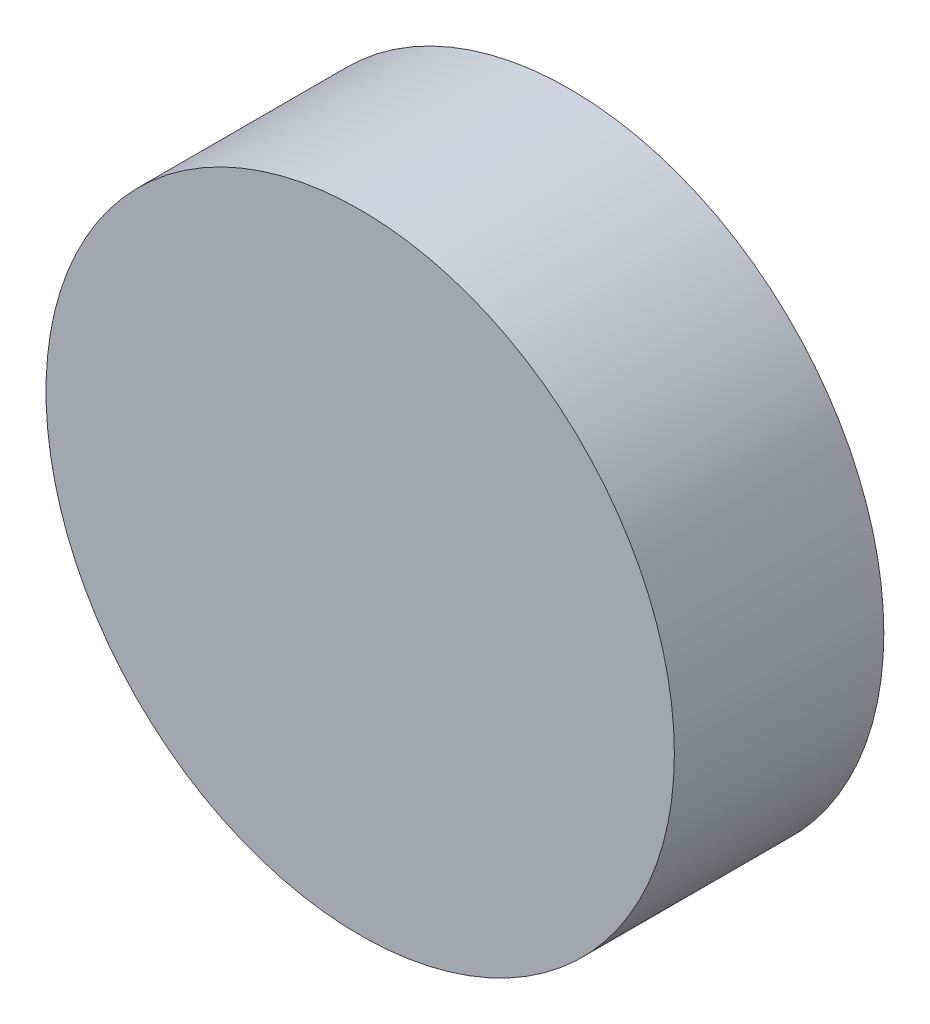
ISO-10303-21;
HEADER;
FILE_DESCRIPTION(('STEP AP214'),'2;1');
FILE_NAME('part.step','',(''),(''),'','','');
FILE_SCHEMA(('AUTOMOTIVE_DESIGN { 1 0 10303 214 1 1 1 1 }'));
ENDSEC;
DATA;
#1=APPLICATION_CONTEXT('core data for automotive mechanical design processes');
#2=APPLICATION_PROTOCOL_DEFINITION('international standard','automotive_design',2000,#1);
#3=PRODUCT_CONTEXT('',#1,'mechanical');
#4=PRODUCT('Part','Part','',(#3));
#5=PRODUCT_RELATED_PRODUCT_CATEGORY('part','',(#4));
#6=PRODUCT_DEFINITION_FORMATION('','',#4);
#7=PRODUCT_DEFINITION_CONTEXT('part definition',#1,'design');
#8=PRODUCT_DEFINITION('design','',#6,#7);
#9=PRODUCT_DEFINITION_SHAPE('','',#8);
#10=(LENGTH_UNIT() NAMED_UNIT(*) SI_UNIT(.MILLI.,.METRE.));
#11=(NAMED_UNIT(*) PLANE_ANGLE_UNIT() SI_UNIT($,.RADIAN.));
#12=(NAMED_UNIT(*) SI_UNIT($,.STERADIAN.) SOLID_ANGLE_UNIT());
#13=UNCERTAINTY_MEASURE_WITH_UNIT(LENGTH_MEASURE(1.E-05),#10,'distance_accuracy_value','');
#14=(GEOMETRIC_REPRESENTATION_CONTEXT(3) GLOBAL_UNCERTAINTY_ASSIGNED_CONTEXT((#13)) GLOBAL_UNIT_ASSIGNED_CONTEXT((#10,
#11,#12)) REPRESENTATION_CONTEXT('',''));
#15=CARTESIAN_POINT('',(0.,0.,0.));
#16=DIRECTION('',(0.,0.,1.));
#17=DIRECTION('',(1.,0.,0.));
#18=AXIS2_PLACEMENT_3D('',#15,#16,#17);
#19=CARTESIAN_POINT('',(16.252683353424,-4.898529243469,0.300000015786));
#20=DIRECTION('',(0.,0.,-1.));
#21=DIRECTION('',(1.,0.,0.));
#22=AXIS2_PLACEMENT_3D('',#19,#20,#21);
#23=CYLINDRICAL_SURFACE('',#22,0.15);
#24=CARTESIAN_POINT('',(16.252683353424,-4.898529243469,0.300000015786));
#25=DIRECTION('',(0.,0.,1.));
#26=DIRECTION('',(1.,0.,0.));
#27=AXIS2_PLACEMENT_3D('',#24,#25,#26);
#28=CIRCLE('',#27,0.15);
#29=CARTESIAN_POINT('',(16.402683353424,-4.898529243469,0.300000015786));
#30=VERTEX_POINT('',#29);
#31=EDGE_CURVE('E11',#30,#30,#28,.T.);
#32=ORIENTED_EDGE('',*,*,#31,.T.);
#33=DIRECTION('',(0.,0.,1.));
#34=VECTOR('',#33,1.);
#35=CARTESIAN_POINT('',(16.402683353424,-4.898529243469,0.300000015786));
#36=LINE('',#35,#34);
#37=CARTESIAN_POINT('',(16.402683353424,-4.898529243469,0.400000015786));
#38=VERTEX_POINT('',#37);
#39=EDGE_CURVE('E26',#30,#38,#36,.T.);
#40=ORIENTED_EDGE('',*,*,#39,.T.);
#41=CARTESIAN_POINT('',(16.252683353424,-4.898529243469,0.400000015786));
#42=DIRECTION('',(0.,0.,1.));
#43=DIRECTION('',(1.,0.,0.));
#44=AXIS2_PLACEMENT_3D('',#41,#42,#43);
#45=CIRCLE('',#44,0.15);
#46=EDGE_CURVE('E20',#38,#38,#45,.T.);
#47=ORIENTED_EDGE('',*,*,#46,.F.);
#48=ORIENTED_EDGE('',*,*,#39,.F.);
#49=EDGE_LOOP('',(#32,#40,#47,#48));
#50=FACE_BOUND('',#49,.T.);
#51=ADVANCED_FACE('F16',(#50),#23,.T.);
#52=CARTESIAN_POINT('',(16.252683353424,-4.898529243469,0.300000015786));
#53=DIRECTION('',(0.,0.,1.));
#54=DIRECTION('',(1.,0.,0.));
#55=AXIS2_PLACEMENT_3D('',#52,#53,#54);
#56=PLANE('',#55);
#57=ORIENTED_EDGE('',*,*,#31,.F.);
#58=EDGE_LOOP('',(#57));
#59=FACE_BOUND('',#58,.T.);
#60=ADVANCED_FACE('F18',(#59),#56,.F.);
#61=CARTESIAN_POINT('',(16.252683353424,-4.898529243469,0.400000015786));
#62=DIRECTION('',(0.,0.,1.));
#63=DIRECTION('',(1.,0.,0.));
#64=AXIS2_PLACEMENT_3D('',#61,#62,#63);
#65=PLANE('',#64);
#66=ORIENTED_EDGE('',*,*,#46,.T.);
#67=EDGE_LOOP('',(#66));
#68=FACE_BOUND('',#67,.T.);
#69=ADVANCED_FACE('F44',(#68),#65,.T.);
#70=CLOSED_SHELL('',(#51,#60,#69));
#71=MANIFOLD_SOLID_BREP('B1',#70);
#72=ADVANCED_BREP_SHAPE_REPRESENTATION('',(#18,#71),#14);
#73=SHAPE_DEFINITION_REPRESENTATION(#9,#72);
ENDSEC;
END-ISO-10303-21;
